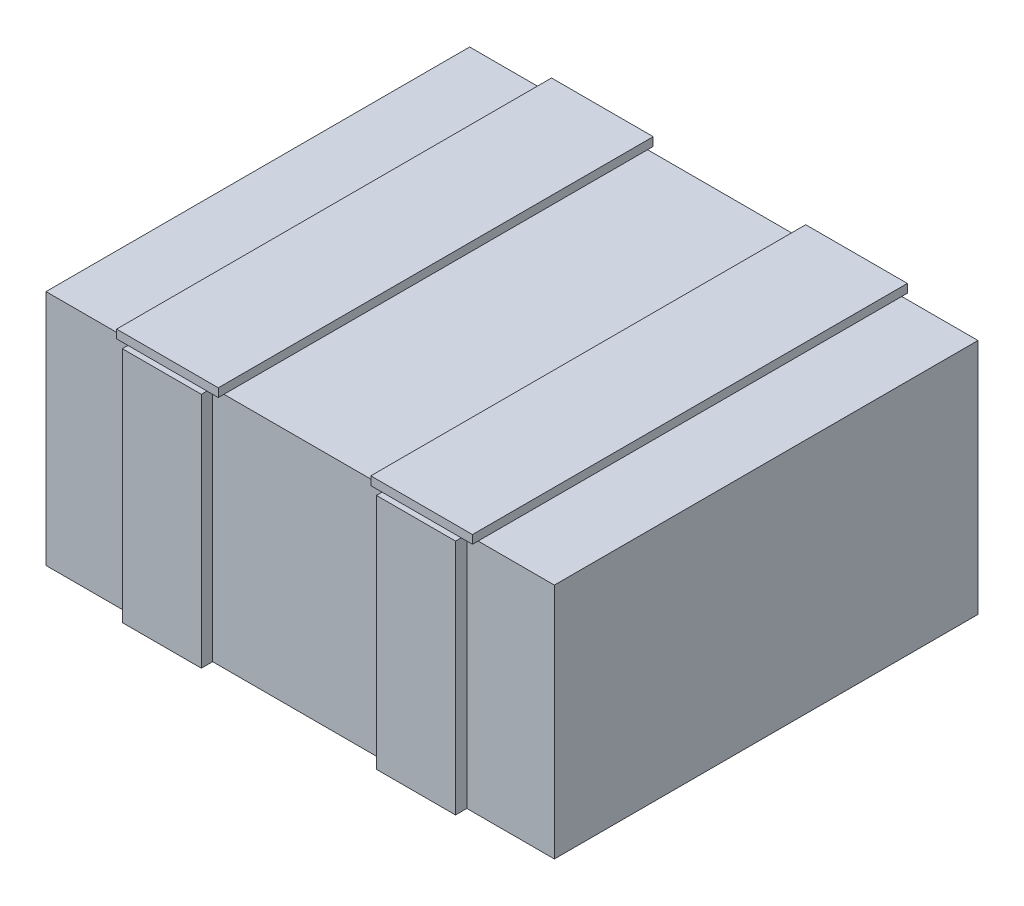
ISO-10303-21;
HEADER;
FILE_DESCRIPTION(('STEP AP214'),'2;1');
FILE_NAME('part.step','',(''),(''),'','','');
FILE_SCHEMA(('AUTOMOTIVE_DESIGN { 1 0 10303 214 1 1 1 1 }'));
ENDSEC;
DATA;
#1=APPLICATION_CONTEXT('core data for automotive mechanical design processes');
#2=APPLICATION_PROTOCOL_DEFINITION('international standard','automotive_design',2000,#1);
#3=PRODUCT_CONTEXT('',#1,'mechanical');
#4=PRODUCT('Part','Part','',(#3));
#5=PRODUCT_RELATED_PRODUCT_CATEGORY('part','',(#4));
#6=PRODUCT_DEFINITION_FORMATION('','',#4);
#7=PRODUCT_DEFINITION_CONTEXT('part definition',#1,'design');
#8=PRODUCT_DEFINITION('design','',#6,#7);
#9=PRODUCT_DEFINITION_SHAPE('','',#8);
#10=(LENGTH_UNIT() NAMED_UNIT(*) SI_UNIT(.MILLI.,.METRE.));
#11=(NAMED_UNIT(*) PLANE_ANGLE_UNIT() SI_UNIT($,.RADIAN.));
#12=(NAMED_UNIT(*) SI_UNIT($,.STERADIAN.) SOLID_ANGLE_UNIT());
#13=UNCERTAINTY_MEASURE_WITH_UNIT(LENGTH_MEASURE(1.E-05),#10,'distance_accuracy_value','');
#14=(GEOMETRIC_REPRESENTATION_CONTEXT(3) GLOBAL_UNCERTAINTY_ASSIGNED_CONTEXT((#13)) GLOBAL_UNIT_ASSIGNED_CONTEXT((#10,
#11,#12)) REPRESENTATION_CONTEXT('',''));
#15=CARTESIAN_POINT('',(0.,0.,0.));
#16=DIRECTION('',(0.,0.,1.));
#17=DIRECTION('',(1.,0.,0.));
#18=AXIS2_PLACEMENT_3D('',#15,#16,#17);
#19=CARTESIAN_POINT('',(-45.,42.,37.5));
#20=DIRECTION('',(0.,0.,-1.));
#21=DIRECTION('',(-1.,0.,0.));
#22=AXIS2_PLACEMENT_3D('',#19,#20,#21);
#23=PLANE('',#22);
#24=DIRECTION('',(0.,-1.,0.));
#25=VECTOR('',#24,1.);
#26=CARTESIAN_POINT('',(15.5,42.,37.5));
#27=LINE('',#26,#25);
#28=CARTESIAN_POINT('',(15.5,42.,37.5));
#29=VERTEX_POINT('',#28);
#30=CARTESIAN_POINT('',(15.5,0.,37.5));
#31=VERTEX_POINT('',#30);
#32=EDGE_CURVE('E607',#29,#31,#27,.T.);
#33=ORIENTED_EDGE('',*,*,#32,.F.);
#34=DIRECTION('',(1.,0.,0.));
#35=VECTOR('',#34,1.);
#36=CARTESIAN_POINT('',(-45.,42.,37.5));
#37=LINE('',#36,#35);
#38=CARTESIAN_POINT('',(13.5,42.,37.5));
#39=VERTEX_POINT('',#38);
#40=EDGE_CURVE('E570',#39,#29,#37,.T.);
#41=ORIENTED_EDGE('',*,*,#40,.F.);
#42=CARTESIAN_POINT('',(-13.5,42.,37.5));
#43=VERTEX_POINT('',#42);
#44=EDGE_CURVE('E564',#43,#39,#37,.T.);
#45=ORIENTED_EDGE('',*,*,#44,.F.);
#46=CARTESIAN_POINT('',(-15.5,42.,37.5));
#47=VERTEX_POINT('',#46);
#48=EDGE_CURVE('E563',#47,#43,#37,.T.);
#49=ORIENTED_EDGE('',*,*,#48,.F.);
#50=DIRECTION('',(0.,-1.,0.));
#51=VECTOR('',#50,1.);
#52=CARTESIAN_POINT('',(-15.5,42.,37.5));
#53=LINE('',#52,#51);
#54=CARTESIAN_POINT('',(-15.5,0.,37.5));
#55=VERTEX_POINT('',#54);
#56=EDGE_CURVE('E351',#47,#55,#53,.T.);
#57=ORIENTED_EDGE('',*,*,#56,.T.);
#58=DIRECTION('',(1.,0.,0.));
#59=VECTOR('',#58,1.);
#60=CARTESIAN_POINT('',(-45.,0.,37.5));
#61=LINE('',#60,#59);
#62=EDGE_CURVE('E494',#55,#31,#61,.T.);
#63=ORIENTED_EDGE('',*,*,#62,.T.);
#64=EDGE_LOOP('',(#33,#41,#45,#49,#57,#63));
#65=FACE_BOUND('',#64,.T.);
#66=ADVANCED_FACE('F43',(#65),#23,.F.);
#67=CARTESIAN_POINT('',(0.,42.,0.));
#68=DIRECTION('',(0.,1.,0.));
#69=DIRECTION('',(0.,0.,1.));
#70=AXIS2_PLACEMENT_3D('',#67,#68,#69);
#71=PLANE('',#70);
#72=ORIENTED_EDGE('',*,*,#40,.T.);
#73=DIRECTION('',(0.,0.,1.));
#74=VECTOR('',#73,1.);
#75=CARTESIAN_POINT('',(15.5,42.,37.5));
#76=LINE('',#75,#74);
#77=CARTESIAN_POINT('',(15.5,42.,38.5));
#78=VERTEX_POINT('',#77);
#79=EDGE_CURVE('E289',#29,#78,#76,.T.);
#80=ORIENTED_EDGE('',*,*,#79,.T.);
#81=DIRECTION('',(1.,0.,0.));
#82=VECTOR('',#81,1.);
#83=CARTESIAN_POINT('',(13.5,42.,38.5));
#84=LINE('',#83,#82);
#85=CARTESIAN_POINT('',(13.5,42.,38.5));
#86=VERTEX_POINT('',#85);
#87=EDGE_CURVE('E410',#86,#78,#84,.T.);
#88=ORIENTED_EDGE('',*,*,#87,.F.);
#89=DIRECTION('',(0.,0.,1.));
#90=VECTOR('',#89,1.);
#91=CARTESIAN_POINT('',(13.5,42.,-38.5));
#92=LINE('',#91,#90);
#93=EDGE_CURVE('E394',#39,#86,#92,.T.);
#94=ORIENTED_EDGE('',*,*,#93,.F.);
#95=EDGE_LOOP('',(#72,#80,#88,#94));
#96=FACE_BOUND('',#95,.T.);
#97=ADVANCED_FACE('F626',(#96),#71,.F.);
#98=CARTESIAN_POINT('',(45.,42.,-37.5));
#99=DIRECTION('',(0.,0.,1.));
#100=DIRECTION('',(1.,0.,0.));
#101=AXIS2_PLACEMENT_3D('',#98,#99,#100);
#102=PLANE('',#101);
#103=DIRECTION('',(0.,-1.,0.));
#104=VECTOR('',#103,1.);
#105=CARTESIAN_POINT('',(29.5,42.,-37.5));
#106=LINE('',#105,#104);
#107=CARTESIAN_POINT('',(29.5,42.,-37.5));
#108=VERTEX_POINT('',#107);
#109=CARTESIAN_POINT('',(29.5,0.,-37.5));
#110=VERTEX_POINT('',#109);
#111=EDGE_CURVE('E332',#108,#110,#106,.T.);
#112=ORIENTED_EDGE('',*,*,#111,.F.);
#113=DIRECTION('',(-1.,0.,0.));
#114=VECTOR('',#113,1.);
#115=CARTESIAN_POINT('',(45.,42.,-37.5));
#116=LINE('',#115,#114);
#117=CARTESIAN_POINT('',(31.5,42.,-37.5));
#118=VERTEX_POINT('',#117);
#119=EDGE_CURVE('E484',#118,#108,#116,.T.);
#120=ORIENTED_EDGE('',*,*,#119,.F.);
#121=CARTESIAN_POINT('',(45.,42.,-37.5));
#122=VERTEX_POINT('',#121);
#123=EDGE_CURVE('E485',#122,#118,#116,.T.);
#124=ORIENTED_EDGE('',*,*,#123,.F.);
#125=DIRECTION('',(0.,-1.,0.));
#126=VECTOR('',#125,1.);
#127=CARTESIAN_POINT('',(45.,42.,-37.5));
#128=LINE('',#127,#126);
#129=CARTESIAN_POINT('',(45.,0.,-37.5));
#130=VERTEX_POINT('',#129);
#131=EDGE_CURVE('E502',#122,#130,#128,.T.);
#132=ORIENTED_EDGE('',*,*,#131,.T.);
#133=DIRECTION('',(-1.,0.,0.));
#134=VECTOR('',#133,1.);
#135=CARTESIAN_POINT('',(45.,0.,-37.5));
#136=LINE('',#135,#134);
#137=EDGE_CURVE('E471',#130,#110,#136,.T.);
#138=ORIENTED_EDGE('',*,*,#137,.T.);
#139=EDGE_LOOP('',(#112,#120,#124,#132,#138));
#140=FACE_BOUND('',#139,.T.);
#141=ADVANCED_FACE('F587',(#140),#102,.F.);
#142=DIRECTION('',(-1.,0.,0.));
#143=VECTOR('',#142,1.);
#144=CARTESIAN_POINT('',(31.5,42.,-38.5));
#145=LINE('',#144,#143);
#146=CARTESIAN_POINT('',(15.5,42.,-38.5));
#147=VERTEX_POINT('',#146);
#148=CARTESIAN_POINT('',(13.5,42.,-38.5));
#149=VERTEX_POINT('',#148);
#150=EDGE_CURVE('E418',#147,#149,#145,.T.);
#151=ORIENTED_EDGE('',*,*,#150,.F.);
#152=DIRECTION('',(0.,0.,1.));
#153=VECTOR('',#152,1.);
#154=CARTESIAN_POINT('',(15.5,42.,-39.5));
#155=LINE('',#154,#153);
#156=CARTESIAN_POINT('',(15.5,42.,-37.5));
#157=VERTEX_POINT('',#156);
#158=EDGE_CURVE('E316',#147,#157,#155,.T.);
#159=ORIENTED_EDGE('',*,*,#158,.T.);
#160=CARTESIAN_POINT('',(13.5,42.,-37.5));
#161=VERTEX_POINT('',#160);
#162=EDGE_CURVE('E486',#157,#161,#116,.T.);
#163=ORIENTED_EDGE('',*,*,#162,.T.);
#164=EDGE_CURVE('E404',#149,#161,#92,.T.);
#165=ORIENTED_EDGE('',*,*,#164,.F.);
#166=EDGE_LOOP('',(#151,#159,#163,#165));
#167=FACE_BOUND('',#166,.T.);
#168=ADVANCED_FACE('F634',(#167),#71,.F.);
#169=DIRECTION('',(0.,-1.,0.));
#170=VECTOR('',#169,1.);
#171=CARTESIAN_POINT('',(-29.5,42.,37.5));
#172=LINE('',#171,#170);
#173=CARTESIAN_POINT('',(-29.5,42.,37.5));
#174=VERTEX_POINT('',#173);
#175=CARTESIAN_POINT('',(-29.5,0.,37.5));
#176=VERTEX_POINT('',#175);
#177=EDGE_CURVE('E350',#174,#176,#172,.T.);
#178=ORIENTED_EDGE('',*,*,#177,.F.);
#179=CARTESIAN_POINT('',(-31.5,42.,37.5));
#180=VERTEX_POINT('',#179);
#181=EDGE_CURVE('E476',#180,#174,#37,.T.);
#182=ORIENTED_EDGE('',*,*,#181,.F.);
#183=CARTESIAN_POINT('',(-45.,42.,37.5));
#184=VERTEX_POINT('',#183);
#185=EDGE_CURVE('E475',#184,#180,#37,.T.);
#186=ORIENTED_EDGE('',*,*,#185,.F.);
#187=DIRECTION('',(0.,-1.,0.));
#188=VECTOR('',#187,1.);
#189=CARTESIAN_POINT('',(-45.,42.,37.5));
#190=LINE('',#189,#188);
#191=CARTESIAN_POINT('',(-45.,0.,37.5));
#192=VERTEX_POINT('',#191);
#193=EDGE_CURVE('E50',#184,#192,#190,.T.);
#194=ORIENTED_EDGE('',*,*,#193,.T.);
#195=EDGE_CURVE('E491',#192,#176,#61,.T.);
#196=ORIENTED_EDGE('',*,*,#195,.T.);
#197=EDGE_LOOP('',(#178,#182,#186,#194,#196));
#198=FACE_BOUND('',#197,.T.);
#199=ADVANCED_FACE('F559',(#198),#23,.F.);
#200=CARTESIAN_POINT('',(0.,42.,0.));
#201=DIRECTION('',(0.,1.,0.));
#202=DIRECTION('',(0.,0.,1.));
#203=AXIS2_PLACEMENT_3D('',#200,#201,#202);
#204=PLANE('',#203);
#205=ORIENTED_EDGE('',*,*,#181,.T.);
#206=DIRECTION('',(0.,0.,1.));
#207=VECTOR('',#206,1.);
#208=CARTESIAN_POINT('',(-29.5,42.,37.5));
#209=LINE('',#208,#207);
#210=CARTESIAN_POINT('',(-29.5,42.,38.5));
#211=VERTEX_POINT('',#210);
#212=EDGE_CURVE('E339',#174,#211,#209,.T.);
#213=ORIENTED_EDGE('',*,*,#212,.T.);
#214=DIRECTION('',(1.,0.,0.));
#215=VECTOR('',#214,1.);
#216=CARTESIAN_POINT('',(-31.5,42.,38.5));
#217=LINE('',#216,#215);
#218=CARTESIAN_POINT('',(-31.5,42.,38.5));
#219=VERTEX_POINT('',#218);
#220=EDGE_CURVE('E443',#219,#211,#217,.T.);
#221=ORIENTED_EDGE('',*,*,#220,.F.);
#222=DIRECTION('',(0.,0.,1.));
#223=VECTOR('',#222,1.);
#224=CARTESIAN_POINT('',(-31.5,42.,-38.5));
#225=LINE('',#224,#223);
#226=EDGE_CURVE('E54',#180,#219,#225,.T.);
#227=ORIENTED_EDGE('',*,*,#226,.F.);
#228=EDGE_LOOP('',(#205,#213,#221,#227));
#229=FACE_BOUND('',#228,.T.);
#230=ADVANCED_FACE('F565',(#229),#204,.F.);
#231=ORIENTED_EDGE('',*,*,#162,.F.);
#232=DIRECTION('',(0.,-1.,0.));
#233=VECTOR('',#232,1.);
#234=CARTESIAN_POINT('',(15.5,42.,-37.5));
#235=LINE('',#234,#233);
#236=CARTESIAN_POINT('',(15.5,0.,-37.5));
#237=VERTEX_POINT('',#236);
#238=EDGE_CURVE('E334',#157,#237,#235,.T.);
#239=ORIENTED_EDGE('',*,*,#238,.T.);
#240=CARTESIAN_POINT('',(-15.5,0.,-37.5));
#241=VERTEX_POINT('',#240);
#242=EDGE_CURVE('E498',#237,#241,#136,.T.);
#243=ORIENTED_EDGE('',*,*,#242,.T.);
#244=DIRECTION('',(0.,-1.,0.));
#245=VECTOR('',#244,1.);
#246=CARTESIAN_POINT('',(-15.5,42.,-37.5));
#247=LINE('',#246,#245);
#248=CARTESIAN_POINT('',(-15.5,42.,-37.5));
#249=VERTEX_POINT('',#248);
#250=EDGE_CURVE('E387',#249,#241,#247,.T.);
#251=ORIENTED_EDGE('',*,*,#250,.F.);
#252=CARTESIAN_POINT('',(-13.5,42.,-37.5));
#253=VERTEX_POINT('',#252);
#254=EDGE_CURVE('E490',#253,#249,#116,.T.);
#255=ORIENTED_EDGE('',*,*,#254,.F.);
#256=EDGE_CURVE('E592',#161,#253,#116,.T.);
#257=ORIENTED_EDGE('',*,*,#256,.F.);
#258=EDGE_LOOP('',(#231,#239,#243,#251,#255,#257));
#259=FACE_BOUND('',#258,.T.);
#260=ADVANCED_FACE('F537',(#259),#102,.F.);
#261=DIRECTION('',(-1.,0.,0.));
#262=VECTOR('',#261,1.);
#263=CARTESIAN_POINT('',(-13.5,42.,-38.5));
#264=LINE('',#263,#262);
#265=CARTESIAN_POINT('',(-29.5,42.,-38.5));
#266=VERTEX_POINT('',#265);
#267=CARTESIAN_POINT('',(-31.5,42.,-38.5));
#268=VERTEX_POINT('',#267);
#269=EDGE_CURVE('E452',#266,#268,#264,.T.);
#270=ORIENTED_EDGE('',*,*,#269,.F.);
#271=DIRECTION('',(0.,0.,1.));
#272=VECTOR('',#271,1.);
#273=CARTESIAN_POINT('',(-29.5,42.,-39.5));
#274=LINE('',#273,#272);
#275=CARTESIAN_POINT('',(-29.5,42.,-37.5));
#276=VERTEX_POINT('',#275);
#277=EDGE_CURVE('E369',#266,#276,#274,.T.);
#278=ORIENTED_EDGE('',*,*,#277,.T.);
#279=CARTESIAN_POINT('',(-31.5,42.,-37.5));
#280=VERTEX_POINT('',#279);
#281=EDGE_CURVE('E761',#276,#280,#116,.T.);
#282=ORIENTED_EDGE('',*,*,#281,.T.);
#283=EDGE_CURVE('E53',#268,#280,#225,.T.);
#284=ORIENTED_EDGE('',*,*,#283,.F.);
#285=EDGE_LOOP('',(#270,#278,#282,#284));
#286=FACE_BOUND('',#285,.T.);
#287=ADVANCED_FACE('F653',(#286),#204,.F.);
#288=CARTESIAN_POINT('',(0.,42.,0.));
#289=DIRECTION('',(0.,1.,0.));
#290=DIRECTION('',(0.,0.,1.));
#291=AXIS2_PLACEMENT_3D('',#288,#289,#290);
#292=PLANE('',#291);
#293=EDGE_CURVE('E407',#161,#39,#92,.T.);
#294=ORIENTED_EDGE('',*,*,#293,.F.);
#295=ORIENTED_EDGE('',*,*,#256,.T.);
#296=DIRECTION('',(0.,0.,-1.));
#297=VECTOR('',#296,1.);
#298=CARTESIAN_POINT('',(-13.5,42.,38.5));
#299=LINE('',#298,#297);
#300=EDGE_CURVE('E55',#43,#253,#299,.T.);
#301=ORIENTED_EDGE('',*,*,#300,.F.);
#302=ORIENTED_EDGE('',*,*,#44,.T.);
#303=EDGE_LOOP('',(#294,#295,#301,#302));
#304=FACE_BOUND('',#303,.T.);
#305=ADVANCED_FACE('F650',(#304),#292,.T.);
#306=EDGE_CURVE('E11',#280,#180,#225,.T.);
#307=ORIENTED_EDGE('',*,*,#306,.F.);
#308=CARTESIAN_POINT('',(-45.,42.,-37.5));
#309=VERTEX_POINT('',#308);
#310=EDGE_CURVE('E481',#280,#309,#116,.T.);
#311=ORIENTED_EDGE('',*,*,#310,.T.);
#312=DIRECTION('',(0.,0.,1.));
#313=VECTOR('',#312,1.);
#314=CARTESIAN_POINT('',(-45.,42.,-37.5));
#315=LINE('',#314,#313);
#316=EDGE_CURVE('E468',#309,#184,#315,.T.);
#317=ORIENTED_EDGE('',*,*,#316,.T.);
#318=ORIENTED_EDGE('',*,*,#185,.T.);
#319=EDGE_LOOP('',(#307,#311,#317,#318));
#320=FACE_BOUND('',#319,.T.);
#321=ADVANCED_FACE('F641',(#320),#292,.T.);
#322=CARTESIAN_POINT('',(-45.,42.,-37.5));
#323=DIRECTION('',(1.,0.,0.));
#324=DIRECTION('',(0.,0.,-1.));
#325=AXIS2_PLACEMENT_3D('',#322,#323,#324);
#326=PLANE('',#325);
#327=DIRECTION('',(0.,0.,1.));
#328=VECTOR('',#327,1.);
#329=CARTESIAN_POINT('',(-45.,0.,-37.5));
#330=LINE('',#329,#328);
#331=CARTESIAN_POINT('',(-45.,0.,-37.5));
#332=VERTEX_POINT('',#331);
#333=EDGE_CURVE('E467',#332,#192,#330,.T.);
#334=ORIENTED_EDGE('',*,*,#333,.T.);
#335=ORIENTED_EDGE('',*,*,#193,.F.);
#336=ORIENTED_EDGE('',*,*,#316,.F.);
#337=DIRECTION('',(0.,-1.,0.));
#338=VECTOR('',#337,1.);
#339=CARTESIAN_POINT('',(-45.,42.,-37.5));
#340=LINE('',#339,#338);
#341=EDGE_CURVE('E482',#309,#332,#340,.T.);
#342=ORIENTED_EDGE('',*,*,#341,.T.);
#343=EDGE_LOOP('',(#334,#335,#336,#342));
#344=FACE_BOUND('',#343,.T.);
#345=ADVANCED_FACE('F44',(#344),#326,.F.);
#346=CARTESIAN_POINT('',(29.5,42.,37.5));
#347=VERTEX_POINT('',#346);
#348=CARTESIAN_POINT('',(31.5,42.,37.5));
#349=VERTEX_POINT('',#348);
#350=EDGE_CURVE('E479',#347,#349,#37,.T.);
#351=ORIENTED_EDGE('',*,*,#350,.F.);
#352=DIRECTION('',(0.,-1.,0.));
#353=VECTOR('',#352,1.);
#354=CARTESIAN_POINT('',(29.5,42.,37.5));
#355=LINE('',#354,#353);
#356=CARTESIAN_POINT('',(29.5,0.,37.5));
#357=VERTEX_POINT('',#356);
#358=EDGE_CURVE('E64',#347,#357,#355,.T.);
#359=ORIENTED_EDGE('',*,*,#358,.T.);
#360=CARTESIAN_POINT('',(45.,0.,37.5));
#361=VERTEX_POINT('',#360);
#362=EDGE_CURVE('E489',#357,#361,#61,.T.);
#363=ORIENTED_EDGE('',*,*,#362,.T.);
#364=DIRECTION('',(0.,-1.,0.));
#365=VECTOR('',#364,1.);
#366=CARTESIAN_POINT('',(45.,42.,37.5));
#367=LINE('',#366,#365);
#368=CARTESIAN_POINT('',(45.,42.,37.5));
#369=VERTEX_POINT('',#368);
#370=EDGE_CURVE('E501',#369,#361,#367,.T.);
#371=ORIENTED_EDGE('',*,*,#370,.F.);
#372=EDGE_CURVE('E472',#349,#369,#37,.T.);
#373=ORIENTED_EDGE('',*,*,#372,.F.);
#374=EDGE_LOOP('',(#351,#359,#363,#371,#373));
#375=FACE_BOUND('',#374,.T.);
#376=ADVANCED_FACE('F582',(#375),#23,.F.);
#377=CARTESIAN_POINT('',(45.,42.,37.5));
#378=DIRECTION('',(-1.,0.,0.));
#379=DIRECTION('',(0.,0.,1.));
#380=AXIS2_PLACEMENT_3D('',#377,#378,#379);
#381=PLANE('',#380);
#382=DIRECTION('',(0.,0.,-1.));
#383=VECTOR('',#382,1.);
#384=CARTESIAN_POINT('',(45.,0.,37.5));
#385=LINE('',#384,#383);
#386=EDGE_CURVE('E493',#361,#130,#385,.T.);
#387=ORIENTED_EDGE('',*,*,#386,.T.);
#388=ORIENTED_EDGE('',*,*,#131,.F.);
#389=DIRECTION('',(0.,0.,-1.));
#390=VECTOR('',#389,1.);
#391=CARTESIAN_POINT('',(45.,42.,37.5));
#392=LINE('',#391,#390);
#393=EDGE_CURVE('E480',#369,#122,#392,.T.);
#394=ORIENTED_EDGE('',*,*,#393,.F.);
#395=ORIENTED_EDGE('',*,*,#370,.T.);
#396=EDGE_LOOP('',(#387,#388,#394,#395));
#397=FACE_BOUND('',#396,.T.);
#398=ADVANCED_FACE('F585',(#397),#381,.F.);
#399=ORIENTED_EDGE('',*,*,#281,.F.);
#400=DIRECTION('',(0.,-1.,0.));
#401=VECTOR('',#400,1.);
#402=CARTESIAN_POINT('',(-29.5,42.,-37.5));
#403=LINE('',#402,#401);
#404=CARTESIAN_POINT('',(-29.5,0.,-37.5));
#405=VERTEX_POINT('',#404);
#406=EDGE_CURVE('E386',#276,#405,#403,.T.);
#407=ORIENTED_EDGE('',*,*,#406,.T.);
#408=EDGE_CURVE('E500',#405,#332,#136,.T.);
#409=ORIENTED_EDGE('',*,*,#408,.T.);
#410=ORIENTED_EDGE('',*,*,#341,.F.);
#411=ORIENTED_EDGE('',*,*,#310,.F.);
#412=EDGE_LOOP('',(#399,#407,#409,#410,#411));
#413=FACE_BOUND('',#412,.T.);
#414=ADVANCED_FACE('F547',(#413),#102,.F.);
#415=DIRECTION('',(0.,0.,-1.));
#416=VECTOR('',#415,1.);
#417=CARTESIAN_POINT('',(31.5,42.,38.5));
#418=LINE('',#417,#416);
#419=EDGE_CURVE('E417',#349,#118,#418,.T.);
#420=ORIENTED_EDGE('',*,*,#419,.F.);
#421=ORIENTED_EDGE('',*,*,#372,.T.);
#422=ORIENTED_EDGE('',*,*,#393,.T.);
#423=ORIENTED_EDGE('',*,*,#123,.T.);
#424=EDGE_LOOP('',(#420,#421,#422,#423));
#425=FACE_BOUND('',#424,.T.);
#426=ADVANCED_FACE('F580',(#425),#292,.T.);
#427=CARTESIAN_POINT('',(0.,0.,0.));
#428=DIRECTION('',(0.,1.,0.));
#429=DIRECTION('',(0.,0.,1.));
#430=AXIS2_PLACEMENT_3D('',#427,#428,#429);
#431=PLANE('',#430);
#432=ORIENTED_EDGE('',*,*,#333,.F.);
#433=ORIENTED_EDGE('',*,*,#408,.F.);
#434=DIRECTION('',(0.,0.,1.));
#435=VECTOR('',#434,1.);
#436=CARTESIAN_POINT('',(-29.5,0.,-39.5));
#437=LINE('',#436,#435);
#438=CARTESIAN_POINT('',(-29.5,0.,-39.5));
#439=VERTEX_POINT('',#438);
#440=EDGE_CURVE('E365',#439,#405,#437,.T.);
#441=ORIENTED_EDGE('',*,*,#440,.F.);
#442=DIRECTION('',(-1.,0.,0.));
#443=VECTOR('',#442,1.);
#444=CARTESIAN_POINT('',(-15.5,0.,-39.5));
#445=LINE('',#444,#443);
#446=CARTESIAN_POINT('',(-15.5,0.,-39.5));
#447=VERTEX_POINT('',#446);
#448=EDGE_CURVE('E377',#447,#439,#445,.T.);
#449=ORIENTED_EDGE('',*,*,#448,.F.);
#450=DIRECTION('',(0.,0.,-1.));
#451=VECTOR('',#450,1.);
#452=CARTESIAN_POINT('',(-15.5,0.,-37.5));
#453=LINE('',#452,#451);
#454=EDGE_CURVE('E380',#241,#447,#453,.T.);
#455=ORIENTED_EDGE('',*,*,#454,.F.);
#456=ORIENTED_EDGE('',*,*,#242,.F.);
#457=DIRECTION('',(0.,0.,1.));
#458=VECTOR('',#457,1.);
#459=CARTESIAN_POINT('',(15.5,0.,-39.5));
#460=LINE('',#459,#458);
#461=CARTESIAN_POINT('',(15.5,0.,-39.5));
#462=VERTEX_POINT('',#461);
#463=EDGE_CURVE('E308',#462,#237,#460,.T.);
#464=ORIENTED_EDGE('',*,*,#463,.F.);
#465=DIRECTION('',(-1.,0.,0.));
#466=VECTOR('',#465,1.);
#467=CARTESIAN_POINT('',(29.5,0.,-39.5));
#468=LINE('',#467,#466);
#469=CARTESIAN_POINT('',(29.5,0.,-39.5));
#470=VERTEX_POINT('',#469);
#471=EDGE_CURVE('E322',#470,#462,#468,.T.);
#472=ORIENTED_EDGE('',*,*,#471,.F.);
#473=DIRECTION('',(0.,0.,-1.));
#474=VECTOR('',#473,1.);
#475=CARTESIAN_POINT('',(29.5,0.,-37.5));
#476=LINE('',#475,#474);
#477=EDGE_CURVE('E306',#110,#470,#476,.T.);
#478=ORIENTED_EDGE('',*,*,#477,.F.);
#479=ORIENTED_EDGE('',*,*,#137,.F.);
#480=ORIENTED_EDGE('',*,*,#386,.F.);
#481=ORIENTED_EDGE('',*,*,#362,.F.);
#482=DIRECTION('',(0.,0.,-1.));
#483=VECTOR('',#482,1.);
#484=CARTESIAN_POINT('',(29.5,0.,39.5));
#485=LINE('',#484,#483);
#486=CARTESIAN_POINT('',(29.5,0.,39.5));
#487=VERTEX_POINT('',#486);
#488=EDGE_CURVE('E292',#487,#357,#485,.T.);
#489=ORIENTED_EDGE('',*,*,#488,.F.);
#490=DIRECTION('',(1.,0.,0.));
#491=VECTOR('',#490,1.);
#492=CARTESIAN_POINT('',(15.5,0.,39.5));
#493=LINE('',#492,#491);
#494=CARTESIAN_POINT('',(15.5,0.,39.5));
#495=VERTEX_POINT('',#494);
#496=EDGE_CURVE('E615',#495,#487,#493,.T.);
#497=ORIENTED_EDGE('',*,*,#496,.F.);
#498=DIRECTION('',(0.,0.,1.));
#499=VECTOR('',#498,1.);
#500=CARTESIAN_POINT('',(15.5,0.,37.5));
#501=LINE('',#500,#499);
#502=EDGE_CURVE('E304',#31,#495,#501,.T.);
#503=ORIENTED_EDGE('',*,*,#502,.F.);
#504=ORIENTED_EDGE('',*,*,#62,.F.);
#505=DIRECTION('',(0.,0.,-1.));
#506=VECTOR('',#505,1.);
#507=CARTESIAN_POINT('',(-15.5,0.,39.5));
#508=LINE('',#507,#506);
#509=CARTESIAN_POINT('',(-15.5,0.,39.5));
#510=VERTEX_POINT('',#509);
#511=EDGE_CURVE('E354',#510,#55,#508,.T.);
#512=ORIENTED_EDGE('',*,*,#511,.F.);
#513=DIRECTION('',(1.,0.,0.));
#514=VECTOR('',#513,1.);
#515=CARTESIAN_POINT('',(-29.5,0.,39.5));
#516=LINE('',#515,#514);
#517=CARTESIAN_POINT('',(-29.5,0.,39.5));
#518=VERTEX_POINT('',#517);
#519=EDGE_CURVE('E348',#518,#510,#516,.T.);
#520=ORIENTED_EDGE('',*,*,#519,.F.);
#521=DIRECTION('',(0.,0.,1.));
#522=VECTOR('',#521,1.);
#523=CARTESIAN_POINT('',(-29.5,0.,37.5));
#524=LINE('',#523,#522);
#525=EDGE_CURVE('E338',#176,#518,#524,.T.);
#526=ORIENTED_EDGE('',*,*,#525,.F.);
#527=ORIENTED_EDGE('',*,*,#195,.F.);
#528=EDGE_LOOP('',(#432,#433,#441,#449,#455,#456,#464,#472,#478,#479,#480,#481,#489,#497,#503,
#504,#512,#520,#526,#527));
#529=FACE_BOUND('',#528,.T.);
#530=ADVANCED_FACE('F551',(#529),#431,.F.);
#531=CARTESIAN_POINT('',(-15.5,42.,38.5));
#532=VERTEX_POINT('',#531);
#533=CARTESIAN_POINT('',(-13.5,42.,38.5));
#534=VERTEX_POINT('',#533);
#535=EDGE_CURVE('E441',#532,#534,#217,.T.);
#536=ORIENTED_EDGE('',*,*,#535,.F.);
#537=DIRECTION('',(0.,0.,-1.));
#538=VECTOR('',#537,1.);
#539=CARTESIAN_POINT('',(-15.5,42.,39.5));
#540=LINE('',#539,#538);
#541=EDGE_CURVE('E342',#532,#47,#540,.T.);
#542=ORIENTED_EDGE('',*,*,#541,.T.);
#543=ORIENTED_EDGE('',*,*,#48,.T.);
#544=EDGE_CURVE('E446',#534,#43,#299,.T.);
#545=ORIENTED_EDGE('',*,*,#544,.F.);
#546=EDGE_LOOP('',(#536,#542,#543,#545));
#547=FACE_BOUND('',#546,.T.);
#548=ADVANCED_FACE('F665',(#547),#204,.F.);
#549=ORIENTED_EDGE('',*,*,#254,.T.);
#550=DIRECTION('',(0.,0.,-1.));
#551=VECTOR('',#550,1.);
#552=CARTESIAN_POINT('',(-15.5,42.,-37.5));
#553=LINE('',#552,#551);
#554=CARTESIAN_POINT('',(-15.5,42.,-38.5));
#555=VERTEX_POINT('',#554);
#556=EDGE_CURVE('E367',#249,#555,#553,.T.);
#557=ORIENTED_EDGE('',*,*,#556,.T.);
#558=CARTESIAN_POINT('',(-13.5,42.,-38.5));
#559=VERTEX_POINT('',#558);
#560=EDGE_CURVE('E436',#559,#555,#264,.T.);
#561=ORIENTED_EDGE('',*,*,#560,.F.);
#562=EDGE_CURVE('E447',#253,#559,#299,.T.);
#563=ORIENTED_EDGE('',*,*,#562,.F.);
#564=EDGE_LOOP('',(#549,#557,#561,#563));
#565=FACE_BOUND('',#564,.T.);
#566=ADVANCED_FACE('F530',(#565),#204,.F.);
#567=CARTESIAN_POINT('',(-31.5,43.5,-38.5));
#568=DIRECTION('',(1.,0.,0.));
#569=DIRECTION('',(0.,0.,-1.));
#570=AXIS2_PLACEMENT_3D('',#567,#568,#569);
#571=PLANE('',#570);
#572=ORIENTED_EDGE('',*,*,#283,.T.);
#573=ORIENTED_EDGE('',*,*,#306,.T.);
#574=ORIENTED_EDGE('',*,*,#226,.T.);
#575=DIRECTION('',(0.,-1.,0.));
#576=VECTOR('',#575,1.);
#577=CARTESIAN_POINT('',(-31.5,43.5,38.5));
#578=LINE('',#577,#576);
#579=CARTESIAN_POINT('',(-31.5,43.5,38.5));
#580=VERTEX_POINT('',#579);
#581=EDGE_CURVE('E461',#580,#219,#578,.T.);
#582=ORIENTED_EDGE('',*,*,#581,.F.);
#583=DIRECTION('',(0.,0.,1.));
#584=VECTOR('',#583,1.);
#585=CARTESIAN_POINT('',(-31.5,43.5,-38.5));
#586=LINE('',#585,#584);
#587=CARTESIAN_POINT('',(-31.5,43.5,-38.5));
#588=VERTEX_POINT('',#587);
#589=EDGE_CURVE('E435',#588,#580,#586,.T.);
#590=ORIENTED_EDGE('',*,*,#589,.F.);
#591=DIRECTION('',(0.,-1.,0.));
#592=VECTOR('',#591,1.);
#593=CARTESIAN_POINT('',(-31.5,43.5,-38.5));
#594=LINE('',#593,#592);
#595=EDGE_CURVE('E442',#588,#268,#594,.T.);
#596=ORIENTED_EDGE('',*,*,#595,.T.);
#597=EDGE_LOOP('',(#572,#573,#574,#582,#590,#596));
#598=FACE_BOUND('',#597,.T.);
#599=ADVANCED_FACE('F682',(#598),#571,.F.);
#600=CARTESIAN_POINT('',(-31.5,43.5,38.5));
#601=DIRECTION('',(0.,0.,-1.));
#602=DIRECTION('',(-1.,0.,0.));
#603=AXIS2_PLACEMENT_3D('',#600,#601,#602);
#604=PLANE('',#603);
#605=ORIENTED_EDGE('',*,*,#220,.T.);
#606=EDGE_CURVE('E450',#211,#532,#217,.T.);
#607=ORIENTED_EDGE('',*,*,#606,.T.);
#608=ORIENTED_EDGE('',*,*,#535,.T.);
#609=DIRECTION('',(0.,-1.,0.));
#610=VECTOR('',#609,1.);
#611=CARTESIAN_POINT('',(-13.5,43.5,38.5));
#612=LINE('',#611,#610);
#613=CARTESIAN_POINT('',(-13.5,43.5,38.5));
#614=VERTEX_POINT('',#613);
#615=EDGE_CURVE('E464',#614,#534,#612,.T.);
#616=ORIENTED_EDGE('',*,*,#615,.F.);
#617=DIRECTION('',(1.,0.,0.));
#618=VECTOR('',#617,1.);
#619=CARTESIAN_POINT('',(-31.5,43.5,38.5));
#620=LINE('',#619,#618);
#621=EDGE_CURVE('E434',#580,#614,#620,.T.);
#622=ORIENTED_EDGE('',*,*,#621,.F.);
#623=ORIENTED_EDGE('',*,*,#581,.T.);
#624=EDGE_LOOP('',(#605,#607,#608,#616,#622,#623));
#625=FACE_BOUND('',#624,.T.);
#626=ADVANCED_FACE('F689',(#625),#604,.F.);
#627=CARTESIAN_POINT('',(-13.5,43.5,38.5));
#628=DIRECTION('',(-1.,0.,0.));
#629=DIRECTION('',(0.,0.,1.));
#630=AXIS2_PLACEMENT_3D('',#627,#628,#629);
#631=PLANE('',#630);
#632=ORIENTED_EDGE('',*,*,#544,.T.);
#633=ORIENTED_EDGE('',*,*,#300,.T.);
#634=ORIENTED_EDGE('',*,*,#562,.T.);
#635=DIRECTION('',(0.,-1.,0.));
#636=VECTOR('',#635,1.);
#637=CARTESIAN_POINT('',(-13.5,43.5,-38.5));
#638=LINE('',#637,#636);
#639=CARTESIAN_POINT('',(-13.5,43.5,-38.5));
#640=VERTEX_POINT('',#639);
#641=EDGE_CURVE('E459',#640,#559,#638,.T.);
#642=ORIENTED_EDGE('',*,*,#641,.F.);
#643=DIRECTION('',(0.,0.,-1.));
#644=VECTOR('',#643,1.);
#645=CARTESIAN_POINT('',(-13.5,43.5,38.5));
#646=LINE('',#645,#644);
#647=EDGE_CURVE('E437',#614,#640,#646,.T.);
#648=ORIENTED_EDGE('',*,*,#647,.F.);
#649=ORIENTED_EDGE('',*,*,#615,.T.);
#650=EDGE_LOOP('',(#632,#633,#634,#642,#648,#649));
#651=FACE_BOUND('',#650,.T.);
#652=ADVANCED_FACE('F520',(#651),#631,.F.);
#653=CARTESIAN_POINT('',(-13.5,43.5,-38.5));
#654=DIRECTION('',(0.,0.,1.));
#655=DIRECTION('',(1.,0.,0.));
#656=AXIS2_PLACEMENT_3D('',#653,#654,#655);
#657=PLANE('',#656);
#658=ORIENTED_EDGE('',*,*,#560,.T.);
#659=EDGE_CURVE('E457',#555,#266,#264,.T.);
#660=ORIENTED_EDGE('',*,*,#659,.T.);
#661=ORIENTED_EDGE('',*,*,#269,.T.);
#662=ORIENTED_EDGE('',*,*,#595,.F.);
#663=DIRECTION('',(-1.,0.,0.));
#664=VECTOR('',#663,1.);
#665=CARTESIAN_POINT('',(-13.5,43.5,-38.5));
#666=LINE('',#665,#664);
#667=EDGE_CURVE('E439',#640,#588,#666,.T.);
#668=ORIENTED_EDGE('',*,*,#667,.F.);
#669=ORIENTED_EDGE('',*,*,#641,.T.);
#670=EDGE_LOOP('',(#658,#660,#661,#662,#668,#669));
#671=FACE_BOUND('',#670,.T.);
#672=ADVANCED_FACE('F528',(#671),#657,.F.);
#673=CARTESIAN_POINT('',(0.,43.5,0.));
#674=DIRECTION('',(0.,1.,0.));
#675=DIRECTION('',(0.,0.,1.));
#676=AXIS2_PLACEMENT_3D('',#673,#674,#675);
#677=PLANE('',#676);
#678=ORIENTED_EDGE('',*,*,#589,.T.);
#679=ORIENTED_EDGE('',*,*,#621,.T.);
#680=ORIENTED_EDGE('',*,*,#647,.T.);
#681=ORIENTED_EDGE('',*,*,#667,.T.);
#682=EDGE_LOOP('',(#678,#679,#680,#681));
#683=FACE_BOUND('',#682,.T.);
#684=ADVANCED_FACE('F740',(#683),#677,.T.);
#685=CARTESIAN_POINT('',(29.5,42.,38.5));
#686=VERTEX_POINT('',#685);
#687=CARTESIAN_POINT('',(31.5,42.,38.5));
#688=VERTEX_POINT('',#687);
#689=EDGE_CURVE('E409',#686,#688,#84,.T.);
#690=ORIENTED_EDGE('',*,*,#689,.F.);
#691=DIRECTION('',(0.,0.,-1.));
#692=VECTOR('',#691,1.);
#693=CARTESIAN_POINT('',(29.5,42.,39.5));
#694=LINE('',#693,#692);
#695=EDGE_CURVE('E301',#686,#347,#694,.T.);
#696=ORIENTED_EDGE('',*,*,#695,.T.);
#697=ORIENTED_EDGE('',*,*,#350,.T.);
#698=EDGE_CURVE('E412',#688,#349,#418,.T.);
#699=ORIENTED_EDGE('',*,*,#698,.F.);
#700=EDGE_LOOP('',(#690,#696,#697,#699));
#701=FACE_BOUND('',#700,.T.);
#702=ADVANCED_FACE('F604',(#701),#71,.F.);
#703=ORIENTED_EDGE('',*,*,#119,.T.);
#704=DIRECTION('',(0.,0.,-1.));
#705=VECTOR('',#704,1.);
#706=CARTESIAN_POINT('',(29.5,42.,-37.5));
#707=LINE('',#706,#705);
#708=CARTESIAN_POINT('',(29.5,42.,-38.5));
#709=VERTEX_POINT('',#708);
#710=EDGE_CURVE('E320',#108,#709,#707,.T.);
#711=ORIENTED_EDGE('',*,*,#710,.T.);
#712=CARTESIAN_POINT('',(31.5,42.,-38.5));
#713=VERTEX_POINT('',#712);
#714=EDGE_CURVE('E400',#713,#709,#145,.T.);
#715=ORIENTED_EDGE('',*,*,#714,.F.);
#716=EDGE_CURVE('E415',#118,#713,#418,.T.);
#717=ORIENTED_EDGE('',*,*,#716,.F.);
#718=EDGE_LOOP('',(#703,#711,#715,#717));
#719=FACE_BOUND('',#718,.T.);
#720=ADVANCED_FACE('F596',(#719),#71,.F.);
#721=CARTESIAN_POINT('',(13.5,43.5,-38.5));
#722=DIRECTION('',(1.,0.,0.));
#723=DIRECTION('',(0.,0.,-1.));
#724=AXIS2_PLACEMENT_3D('',#721,#722,#723);
#725=PLANE('',#724);
#726=ORIENTED_EDGE('',*,*,#164,.T.);
#727=ORIENTED_EDGE('',*,*,#293,.T.);
#728=ORIENTED_EDGE('',*,*,#93,.T.);
#729=DIRECTION('',(0.,-1.,0.));
#730=VECTOR('',#729,1.);
#731=CARTESIAN_POINT('',(13.5,43.5,38.5));
#732=LINE('',#731,#730);
#733=CARTESIAN_POINT('',(13.5,43.5,38.5));
#734=VERTEX_POINT('',#733);
#735=EDGE_CURVE('E427',#734,#86,#732,.T.);
#736=ORIENTED_EDGE('',*,*,#735,.F.);
#737=DIRECTION('',(0.,0.,1.));
#738=VECTOR('',#737,1.);
#739=CARTESIAN_POINT('',(13.5,43.5,-38.5));
#740=LINE('',#739,#738);
#741=CARTESIAN_POINT('',(13.5,43.5,-38.5));
#742=VERTEX_POINT('',#741);
#743=EDGE_CURVE('E392',#742,#734,#740,.T.);
#744=ORIENTED_EDGE('',*,*,#743,.F.);
#745=DIRECTION('',(0.,-1.,0.));
#746=VECTOR('',#745,1.);
#747=CARTESIAN_POINT('',(13.5,43.5,-38.5));
#748=LINE('',#747,#746);
#749=EDGE_CURVE('E401',#742,#149,#748,.T.);
#750=ORIENTED_EDGE('',*,*,#749,.T.);
#751=EDGE_LOOP('',(#726,#727,#728,#736,#744,#750));
#752=FACE_BOUND('',#751,.T.);
#753=ADVANCED_FACE('F746',(#752),#725,.F.);
#754=CARTESIAN_POINT('',(13.5,43.5,38.5));
#755=DIRECTION('',(0.,0.,-1.));
#756=DIRECTION('',(-1.,0.,0.));
#757=AXIS2_PLACEMENT_3D('',#754,#755,#756);
#758=PLANE('',#757);
#759=ORIENTED_EDGE('',*,*,#87,.T.);
#760=EDGE_CURVE('E286',#78,#686,#84,.T.);
#761=ORIENTED_EDGE('',*,*,#760,.T.);
#762=ORIENTED_EDGE('',*,*,#689,.T.);
#763=DIRECTION('',(0.,-1.,0.));
#764=VECTOR('',#763,1.);
#765=CARTESIAN_POINT('',(31.5,43.5,38.5));
#766=LINE('',#765,#764);
#767=CARTESIAN_POINT('',(31.5,43.5,38.5));
#768=VERTEX_POINT('',#767);
#769=EDGE_CURVE('E426',#768,#688,#766,.T.);
#770=ORIENTED_EDGE('',*,*,#769,.F.);
#771=DIRECTION('',(1.,0.,0.));
#772=VECTOR('',#771,1.);
#773=CARTESIAN_POINT('',(13.5,43.5,38.5));
#774=LINE('',#773,#772);
#775=EDGE_CURVE('E396',#734,#768,#774,.T.);
#776=ORIENTED_EDGE('',*,*,#775,.F.);
#777=ORIENTED_EDGE('',*,*,#735,.T.);
#778=EDGE_LOOP('',(#759,#761,#762,#770,#776,#777));
#779=FACE_BOUND('',#778,.T.);
#780=ADVANCED_FACE('F744',(#779),#758,.F.);
#781=CARTESIAN_POINT('',(31.5,43.5,38.5));
#782=DIRECTION('',(-1.,0.,0.));
#783=DIRECTION('',(0.,0.,1.));
#784=AXIS2_PLACEMENT_3D('',#781,#782,#783);
#785=PLANE('',#784);
#786=ORIENTED_EDGE('',*,*,#698,.T.);
#787=ORIENTED_EDGE('',*,*,#419,.T.);
#788=ORIENTED_EDGE('',*,*,#716,.T.);
#789=DIRECTION('',(0.,-1.,0.));
#790=VECTOR('',#789,1.);
#791=CARTESIAN_POINT('',(31.5,43.5,-38.5));
#792=LINE('',#791,#790);
#793=CARTESIAN_POINT('',(31.5,43.5,-38.5));
#794=VERTEX_POINT('',#793);
#795=EDGE_CURVE('E421',#794,#713,#792,.T.);
#796=ORIENTED_EDGE('',*,*,#795,.F.);
#797=DIRECTION('',(0.,0.,-1.));
#798=VECTOR('',#797,1.);
#799=CARTESIAN_POINT('',(31.5,43.5,38.5));
#800=LINE('',#799,#798);
#801=EDGE_CURVE('E398',#768,#794,#800,.T.);
#802=ORIENTED_EDGE('',*,*,#801,.F.);
#803=ORIENTED_EDGE('',*,*,#769,.T.);
#804=EDGE_LOOP('',(#786,#787,#788,#796,#802,#803));
#805=FACE_BOUND('',#804,.T.);
#806=ADVANCED_FACE('F597',(#805),#785,.F.);
#807=CARTESIAN_POINT('',(31.5,43.5,-38.5));
#808=DIRECTION('',(0.,0.,1.));
#809=DIRECTION('',(1.,0.,0.));
#810=AXIS2_PLACEMENT_3D('',#807,#808,#809);
#811=PLANE('',#810);
#812=ORIENTED_EDGE('',*,*,#714,.T.);
#813=EDGE_CURVE('E419',#709,#147,#145,.T.);
#814=ORIENTED_EDGE('',*,*,#813,.T.);
#815=ORIENTED_EDGE('',*,*,#150,.T.);
#816=ORIENTED_EDGE('',*,*,#749,.F.);
#817=DIRECTION('',(-1.,0.,0.));
#818=VECTOR('',#817,1.);
#819=CARTESIAN_POINT('',(31.5,43.5,-38.5));
#820=LINE('',#819,#818);
#821=EDGE_CURVE('E402',#794,#742,#820,.T.);
#822=ORIENTED_EDGE('',*,*,#821,.F.);
#823=ORIENTED_EDGE('',*,*,#795,.T.);
#824=EDGE_LOOP('',(#812,#814,#815,#816,#822,#823));
#825=FACE_BOUND('',#824,.T.);
#826=ADVANCED_FACE('F733',(#825),#811,.F.);
#827=CARTESIAN_POINT('',(0.,43.5,0.));
#828=DIRECTION('',(0.,1.,0.));
#829=DIRECTION('',(0.,0.,1.));
#830=AXIS2_PLACEMENT_3D('',#827,#828,#829);
#831=PLANE('',#830);
#832=ORIENTED_EDGE('',*,*,#743,.T.);
#833=ORIENTED_EDGE('',*,*,#775,.T.);
#834=ORIENTED_EDGE('',*,*,#801,.T.);
#835=ORIENTED_EDGE('',*,*,#821,.T.);
#836=EDGE_LOOP('',(#832,#833,#834,#835));
#837=FACE_BOUND('',#836,.T.);
#838=ADVANCED_FACE('F722',(#837),#831,.T.);
#839=CARTESIAN_POINT('',(0.,42.,0.));
#840=DIRECTION('',(0.,1.,0.));
#841=DIRECTION('',(0.,0.,1.));
#842=AXIS2_PLACEMENT_3D('',#839,#840,#841);
#843=PLANE('',#842);
#844=ORIENTED_EDGE('',*,*,#659,.F.);
#845=CARTESIAN_POINT('',(-15.5,42.,-39.5));
#846=VERTEX_POINT('',#845);
#847=EDGE_CURVE('E366',#555,#846,#553,.T.);
#848=ORIENTED_EDGE('',*,*,#847,.T.);
#849=DIRECTION('',(-1.,0.,0.));
#850=VECTOR('',#849,1.);
#851=CARTESIAN_POINT('',(-15.5,42.,-39.5));
#852=LINE('',#851,#850);
#853=CARTESIAN_POINT('',(-29.5,42.,-39.5));
#854=VERTEX_POINT('',#853);
#855=EDGE_CURVE('E373',#846,#854,#852,.T.);
#856=ORIENTED_EDGE('',*,*,#855,.T.);
#857=EDGE_CURVE('E364',#854,#266,#274,.T.);
#858=ORIENTED_EDGE('',*,*,#857,.T.);
#859=EDGE_LOOP('',(#844,#848,#856,#858));
#860=FACE_BOUND('',#859,.T.);
#861=ADVANCED_FACE('F716',(#860),#843,.T.);
#862=CARTESIAN_POINT('',(-29.5,42.,-39.5));
#863=DIRECTION('',(1.,0.,0.));
#864=DIRECTION('',(0.,0.,-1.));
#865=AXIS2_PLACEMENT_3D('',#862,#863,#864);
#866=PLANE('',#865);
#867=ORIENTED_EDGE('',*,*,#440,.T.);
#868=ORIENTED_EDGE('',*,*,#406,.F.);
#869=ORIENTED_EDGE('',*,*,#277,.F.);
#870=ORIENTED_EDGE('',*,*,#857,.F.);
#871=DIRECTION('',(0.,-1.,0.));
#872=VECTOR('',#871,1.);
#873=CARTESIAN_POINT('',(-29.5,42.,-39.5));
#874=LINE('',#873,#872);
#875=EDGE_CURVE('E374',#854,#439,#874,.T.);
#876=ORIENTED_EDGE('',*,*,#875,.T.);
#877=EDGE_LOOP('',(#867,#868,#869,#870,#876));
#878=FACE_BOUND('',#877,.T.);
#879=ADVANCED_FACE('F724',(#878),#866,.F.);
#880=CARTESIAN_POINT('',(-15.5,42.,-37.5));
#881=DIRECTION('',(-1.,0.,0.));
#882=DIRECTION('',(0.,0.,1.));
#883=AXIS2_PLACEMENT_3D('',#880,#881,#882);
#884=PLANE('',#883);
#885=ORIENTED_EDGE('',*,*,#454,.T.);
#886=DIRECTION('',(0.,-1.,0.));
#887=VECTOR('',#886,1.);
#888=CARTESIAN_POINT('',(-15.5,42.,-39.5));
#889=LINE('',#888,#887);
#890=EDGE_CURVE('E382',#846,#447,#889,.T.);
#891=ORIENTED_EDGE('',*,*,#890,.F.);
#892=ORIENTED_EDGE('',*,*,#847,.F.);
#893=ORIENTED_EDGE('',*,*,#556,.F.);
#894=ORIENTED_EDGE('',*,*,#250,.T.);
#895=EDGE_LOOP('',(#885,#891,#892,#893,#894));
#896=FACE_BOUND('',#895,.T.);
#897=ADVANCED_FACE('F531',(#896),#884,.F.);
#898=CARTESIAN_POINT('',(-15.5,42.,-39.5));
#899=DIRECTION('',(0.,0.,1.));
#900=DIRECTION('',(1.,0.,0.));
#901=AXIS2_PLACEMENT_3D('',#898,#899,#900);
#902=PLANE('',#901);
#903=ORIENTED_EDGE('',*,*,#448,.T.);
#904=ORIENTED_EDGE('',*,*,#875,.F.);
#905=ORIENTED_EDGE('',*,*,#855,.F.);
#906=ORIENTED_EDGE('',*,*,#890,.T.);
#907=EDGE_LOOP('',(#903,#904,#905,#906));
#908=FACE_BOUND('',#907,.T.);
#909=ADVANCED_FACE('F721',(#908),#902,.F.);
#910=CARTESIAN_POINT('',(0.,42.,0.));
#911=DIRECTION('',(0.,1.,0.));
#912=DIRECTION('',(0.,0.,1.));
#913=AXIS2_PLACEMENT_3D('',#910,#911,#912);
#914=PLANE('',#913);
#915=ORIENTED_EDGE('',*,*,#606,.F.);
#916=CARTESIAN_POINT('',(-29.5,42.,39.5));
#917=VERTEX_POINT('',#916);
#918=EDGE_CURVE('E341',#211,#917,#209,.T.);
#919=ORIENTED_EDGE('',*,*,#918,.T.);
#920=DIRECTION('',(1.,0.,0.));
#921=VECTOR('',#920,1.);
#922=CARTESIAN_POINT('',(-29.5,42.,39.5));
#923=LINE('',#922,#921);
#924=CARTESIAN_POINT('',(-15.5,42.,39.5));
#925=VERTEX_POINT('',#924);
#926=EDGE_CURVE('E336',#917,#925,#923,.T.);
#927=ORIENTED_EDGE('',*,*,#926,.T.);
#928=EDGE_CURVE('E343',#925,#532,#540,.T.);
#929=ORIENTED_EDGE('',*,*,#928,.T.);
#930=EDGE_LOOP('',(#915,#919,#927,#929));
#931=FACE_BOUND('',#930,.T.);
#932=ADVANCED_FACE('F691',(#931),#914,.T.);
#933=CARTESIAN_POINT('',(-29.5,42.,37.5));
#934=DIRECTION('',(1.,0.,0.));
#935=DIRECTION('',(0.,0.,-1.));
#936=AXIS2_PLACEMENT_3D('',#933,#934,#935);
#937=PLANE('',#936);
#938=ORIENTED_EDGE('',*,*,#525,.T.);
#939=DIRECTION('',(0.,-1.,0.));
#940=VECTOR('',#939,1.);
#941=CARTESIAN_POINT('',(-29.5,42.,39.5));
#942=LINE('',#941,#940);
#943=EDGE_CURVE('E363',#917,#518,#942,.T.);
#944=ORIENTED_EDGE('',*,*,#943,.F.);
#945=ORIENTED_EDGE('',*,*,#918,.F.);
#946=ORIENTED_EDGE('',*,*,#212,.F.);
#947=ORIENTED_EDGE('',*,*,#177,.T.);
#948=EDGE_LOOP('',(#938,#944,#945,#946,#947));
#949=FACE_BOUND('',#948,.T.);
#950=ADVANCED_FACE('F700',(#949),#937,.F.);
#951=CARTESIAN_POINT('',(-29.5,42.,39.5));
#952=DIRECTION('',(0.,0.,-1.));
#953=DIRECTION('',(-1.,0.,0.));
#954=AXIS2_PLACEMENT_3D('',#951,#952,#953);
#955=PLANE('',#954);
#956=ORIENTED_EDGE('',*,*,#519,.T.);
#957=DIRECTION('',(0.,-1.,0.));
#958=VECTOR('',#957,1.);
#959=CARTESIAN_POINT('',(-15.5,42.,39.5));
#960=LINE('',#959,#958);
#961=EDGE_CURVE('E357',#925,#510,#960,.T.);
#962=ORIENTED_EDGE('',*,*,#961,.F.);
#963=ORIENTED_EDGE('',*,*,#926,.F.);
#964=ORIENTED_EDGE('',*,*,#943,.T.);
#965=EDGE_LOOP('',(#956,#962,#963,#964));
#966=FACE_BOUND('',#965,.T.);
#967=ADVANCED_FACE('F699',(#966),#955,.F.);
#968=CARTESIAN_POINT('',(-15.5,42.,39.5));
#969=DIRECTION('',(-1.,0.,0.));
#970=DIRECTION('',(0.,0.,1.));
#971=AXIS2_PLACEMENT_3D('',#968,#969,#970);
#972=PLANE('',#971);
#973=ORIENTED_EDGE('',*,*,#511,.T.);
#974=ORIENTED_EDGE('',*,*,#56,.F.);
#975=ORIENTED_EDGE('',*,*,#541,.F.);
#976=ORIENTED_EDGE('',*,*,#928,.F.);
#977=ORIENTED_EDGE('',*,*,#961,.T.);
#978=EDGE_LOOP('',(#973,#974,#975,#976,#977));
#979=FACE_BOUND('',#978,.T.);
#980=ADVANCED_FACE('F705',(#979),#972,.F.);
#981=CARTESIAN_POINT('',(0.,42.,0.));
#982=DIRECTION('',(0.,1.,0.));
#983=DIRECTION('',(0.,0.,1.));
#984=AXIS2_PLACEMENT_3D('',#981,#982,#983);
#985=PLANE('',#984);
#986=ORIENTED_EDGE('',*,*,#813,.F.);
#987=CARTESIAN_POINT('',(29.5,42.,-39.5));
#988=VERTEX_POINT('',#987);
#989=EDGE_CURVE('E69',#709,#988,#707,.T.);
#990=ORIENTED_EDGE('',*,*,#989,.T.);
#991=DIRECTION('',(-1.,0.,0.));
#992=VECTOR('',#991,1.);
#993=CARTESIAN_POINT('',(29.5,42.,-39.5));
#994=LINE('',#993,#992);
#995=CARTESIAN_POINT('',(15.5,42.,-39.5));
#996=VERTEX_POINT('',#995);
#997=EDGE_CURVE('E319',#988,#996,#994,.T.);
#998=ORIENTED_EDGE('',*,*,#997,.T.);
#999=EDGE_CURVE('E311',#996,#147,#155,.T.);
#1000=ORIENTED_EDGE('',*,*,#999,.T.);
#1001=EDGE_LOOP('',(#986,#990,#998,#1000));
#1002=FACE_BOUND('',#1001,.T.);
#1003=ADVANCED_FACE('F702',(#1002),#985,.T.);
#1004=CARTESIAN_POINT('',(15.5,42.,-39.5));
#1005=DIRECTION('',(1.,0.,0.));
#1006=DIRECTION('',(0.,0.,-1.));
#1007=AXIS2_PLACEMENT_3D('',#1004,#1005,#1006);
#1008=PLANE('',#1007);
#1009=ORIENTED_EDGE('',*,*,#463,.T.);
#1010=ORIENTED_EDGE('',*,*,#238,.F.);
#1011=ORIENTED_EDGE('',*,*,#158,.F.);
#1012=ORIENTED_EDGE('',*,*,#999,.F.);
#1013=DIRECTION('',(0.,-1.,0.));
#1014=VECTOR('',#1013,1.);
#1015=CARTESIAN_POINT('',(15.5,42.,-39.5));
#1016=LINE('',#1015,#1014);
#1017=EDGE_CURVE('E321',#996,#462,#1016,.T.);
#1018=ORIENTED_EDGE('',*,*,#1017,.T.);
#1019=EDGE_LOOP('',(#1009,#1010,#1011,#1012,#1018));
#1020=FACE_BOUND('',#1019,.T.);
#1021=ADVANCED_FACE('F709',(#1020),#1008,.F.);
#1022=CARTESIAN_POINT('',(29.5,42.,-37.5));
#1023=DIRECTION('',(-1.,0.,0.));
#1024=DIRECTION('',(0.,0.,1.));
#1025=AXIS2_PLACEMENT_3D('',#1022,#1023,#1024);
#1026=PLANE('',#1025);
#1027=ORIENTED_EDGE('',*,*,#477,.T.);
#1028=DIRECTION('',(0.,-1.,0.));
#1029=VECTOR('',#1028,1.);
#1030=CARTESIAN_POINT('',(29.5,42.,-39.5));
#1031=LINE('',#1030,#1029);
#1032=EDGE_CURVE('E327',#988,#470,#1031,.T.);
#1033=ORIENTED_EDGE('',*,*,#1032,.F.);
#1034=ORIENTED_EDGE('',*,*,#989,.F.);
#1035=ORIENTED_EDGE('',*,*,#710,.F.);
#1036=ORIENTED_EDGE('',*,*,#111,.T.);
#1037=EDGE_LOOP('',(#1027,#1033,#1034,#1035,#1036));
#1038=FACE_BOUND('',#1037,.T.);
#1039=ADVANCED_FACE('F774',(#1038),#1026,.F.);
#1040=CARTESIAN_POINT('',(29.5,42.,-39.5));
#1041=DIRECTION('',(0.,0.,1.));
#1042=DIRECTION('',(1.,0.,0.));
#1043=AXIS2_PLACEMENT_3D('',#1040,#1041,#1042);
#1044=PLANE('',#1043);
#1045=ORIENTED_EDGE('',*,*,#471,.T.);
#1046=ORIENTED_EDGE('',*,*,#1017,.F.);
#1047=ORIENTED_EDGE('',*,*,#997,.F.);
#1048=ORIENTED_EDGE('',*,*,#1032,.T.);
#1049=EDGE_LOOP('',(#1045,#1046,#1047,#1048));
#1050=FACE_BOUND('',#1049,.T.);
#1051=ADVANCED_FACE('F777',(#1050),#1044,.F.);
#1052=CARTESIAN_POINT('',(0.,42.,0.));
#1053=DIRECTION('',(0.,1.,0.));
#1054=DIRECTION('',(0.,0.,1.));
#1055=AXIS2_PLACEMENT_3D('',#1052,#1053,#1054);
#1056=PLANE('',#1055);
#1057=ORIENTED_EDGE('',*,*,#760,.F.);
#1058=CARTESIAN_POINT('',(15.5,42.,39.5));
#1059=VERTEX_POINT('',#1058);
#1060=EDGE_CURVE('E276',#78,#1059,#76,.T.);
#1061=ORIENTED_EDGE('',*,*,#1060,.T.);
#1062=DIRECTION('',(1.,0.,0.));
#1063=VECTOR('',#1062,1.);
#1064=CARTESIAN_POINT('',(15.5,42.,39.5));
#1065=LINE('',#1064,#1063);
#1066=CARTESIAN_POINT('',(29.5,42.,39.5));
#1067=VERTEX_POINT('',#1066);
#1068=EDGE_CURVE('E282',#1059,#1067,#1065,.T.);
#1069=ORIENTED_EDGE('',*,*,#1068,.T.);
#1070=EDGE_CURVE('E617',#1067,#686,#694,.T.);
#1071=ORIENTED_EDGE('',*,*,#1070,.T.);
#1072=EDGE_LOOP('',(#1057,#1061,#1069,#1071));
#1073=FACE_BOUND('',#1072,.T.);
#1074=ADVANCED_FACE('F283',(#1073),#1056,.T.);
#1075=CARTESIAN_POINT('',(15.5,42.,37.5));
#1076=DIRECTION('',(1.,0.,0.));
#1077=DIRECTION('',(0.,0.,-1.));
#1078=AXIS2_PLACEMENT_3D('',#1075,#1076,#1077);
#1079=PLANE('',#1078);
#1080=ORIENTED_EDGE('',*,*,#502,.T.);
#1081=DIRECTION('',(0.,-1.,0.));
#1082=VECTOR('',#1081,1.);
#1083=CARTESIAN_POINT('',(15.5,42.,39.5));
#1084=LINE('',#1083,#1082);
#1085=EDGE_CURVE('E298',#1059,#495,#1084,.T.);
#1086=ORIENTED_EDGE('',*,*,#1085,.F.);
#1087=ORIENTED_EDGE('',*,*,#1060,.F.);
#1088=ORIENTED_EDGE('',*,*,#79,.F.);
#1089=ORIENTED_EDGE('',*,*,#32,.T.);
#1090=EDGE_LOOP('',(#1080,#1086,#1087,#1088,#1089));
#1091=FACE_BOUND('',#1090,.T.);
#1092=ADVANCED_FACE('F302',(#1091),#1079,.F.);
#1093=CARTESIAN_POINT('',(15.5,42.,39.5));
#1094=DIRECTION('',(0.,0.,-1.));
#1095=DIRECTION('',(-1.,0.,0.));
#1096=AXIS2_PLACEMENT_3D('',#1093,#1094,#1095);
#1097=PLANE('',#1096);
#1098=ORIENTED_EDGE('',*,*,#496,.T.);
#1099=DIRECTION('',(0.,-1.,0.));
#1100=VECTOR('',#1099,1.);
#1101=CARTESIAN_POINT('',(29.5,42.,39.5));
#1102=LINE('',#1101,#1100);
#1103=EDGE_CURVE('E300',#1067,#487,#1102,.T.);
#1104=ORIENTED_EDGE('',*,*,#1103,.F.);
#1105=ORIENTED_EDGE('',*,*,#1068,.F.);
#1106=ORIENTED_EDGE('',*,*,#1085,.T.);
#1107=EDGE_LOOP('',(#1098,#1104,#1105,#1106));
#1108=FACE_BOUND('',#1107,.T.);
#1109=ADVANCED_FACE('F293',(#1108),#1097,.F.);
#1110=CARTESIAN_POINT('',(29.5,42.,39.5));
#1111=DIRECTION('',(-1.,0.,0.));
#1112=DIRECTION('',(0.,0.,1.));
#1113=AXIS2_PLACEMENT_3D('',#1110,#1111,#1112);
#1114=PLANE('',#1113);
#1115=ORIENTED_EDGE('',*,*,#488,.T.);
#1116=ORIENTED_EDGE('',*,*,#358,.F.);
#1117=ORIENTED_EDGE('',*,*,#695,.F.);
#1118=ORIENTED_EDGE('',*,*,#1070,.F.);
#1119=ORIENTED_EDGE('',*,*,#1103,.T.);
#1120=EDGE_LOOP('',(#1115,#1116,#1117,#1118,#1119));
#1121=FACE_BOUND('',#1120,.T.);
#1122=ADVANCED_FACE('F622',(#1121),#1114,.F.);
#1123=CLOSED_SHELL('',(#66,#97,#141,#168,#199,#230,#260,#287,#305,#321,#345,#376,#398,#414,#426,
#530,#548,#566,#599,#626,#652,#672,#684,#702,#720,#753,#780,#806,#826,#838,#861,#879,#897,#909,
#932,#950,#967,#980,#1003,#1021,#1039,#1051,#1074,#1092,#1109,#1122));
#1124=MANIFOLD_SOLID_BREP('B2',#1123);
#1125=ADVANCED_BREP_SHAPE_REPRESENTATION('',(#18,#1124),#14);
#1126=SHAPE_DEFINITION_REPRESENTATION(#9,#1125);
ENDSEC;
END-ISO-10303-21;
